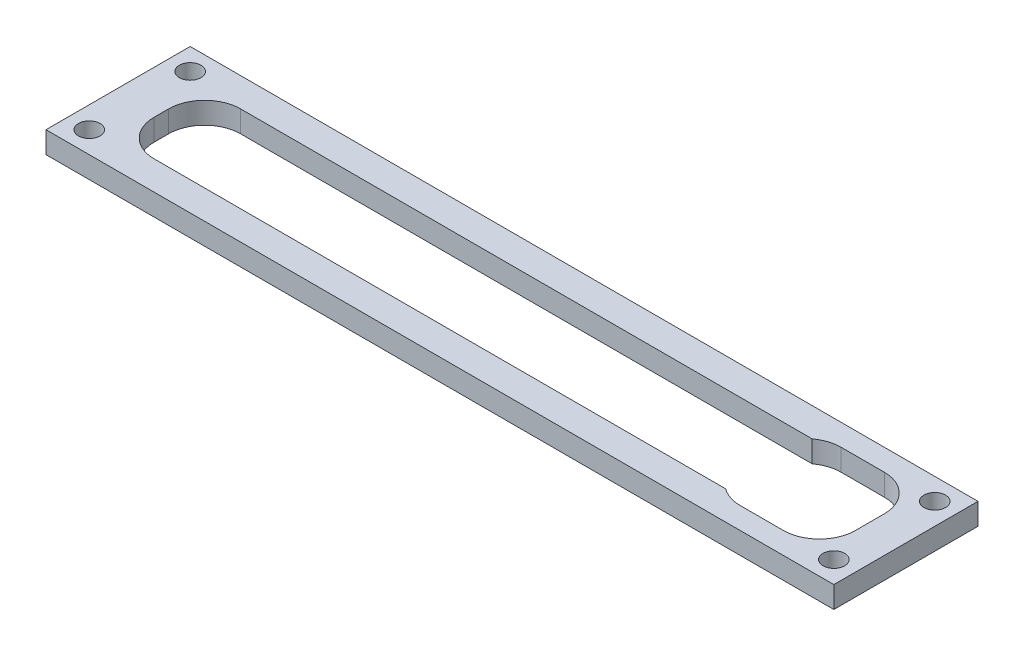
ISO-10303-21;
HEADER;
FILE_DESCRIPTION(('STEP AP214'),'2;1');
FILE_NAME('part.step','',(''),(''),'','','');
FILE_SCHEMA(('AUTOMOTIVE_DESIGN { 1 0 10303 214 1 1 1 1 }'));
ENDSEC;
DATA;
#1=APPLICATION_CONTEXT('core data for automotive mechanical design processes');
#2=APPLICATION_PROTOCOL_DEFINITION('international standard','automotive_design',2000,#1);
#3=PRODUCT_CONTEXT('',#1,'mechanical');
#4=PRODUCT('Part','Part','',(#3));
#5=PRODUCT_RELATED_PRODUCT_CATEGORY('part','',(#4));
#6=PRODUCT_DEFINITION_FORMATION('','',#4);
#7=PRODUCT_DEFINITION_CONTEXT('part definition',#1,'design');
#8=PRODUCT_DEFINITION('design','',#6,#7);
#9=PRODUCT_DEFINITION_SHAPE('','',#8);
#10=(LENGTH_UNIT() NAMED_UNIT(*) SI_UNIT(.MILLI.,.METRE.));
#11=(NAMED_UNIT(*) PLANE_ANGLE_UNIT() SI_UNIT($,.RADIAN.));
#12=(NAMED_UNIT(*) SI_UNIT($,.STERADIAN.) SOLID_ANGLE_UNIT());
#13=UNCERTAINTY_MEASURE_WITH_UNIT(LENGTH_MEASURE(1.E-05),#10,'distance_accuracy_value','');
#14=(GEOMETRIC_REPRESENTATION_CONTEXT(3) GLOBAL_UNCERTAINTY_ASSIGNED_CONTEXT((#13)) GLOBAL_UNIT_ASSIGNED_CONTEXT((#10,
#11,#12)) REPRESENTATION_CONTEXT('',''));
#15=CARTESIAN_POINT('',(0.,0.,0.));
#16=DIRECTION('',(0.,0.,1.));
#17=DIRECTION('',(1.,0.,0.));
#18=AXIS2_PLACEMENT_3D('',#15,#16,#17);
#19=CARTESIAN_POINT('',(0.,3.,0.));
#20=DIRECTION('',(0.,-1.,0.));
#21=DIRECTION('',(0.,0.,-1.));
#22=AXIS2_PLACEMENT_3D('',#19,#20,#21);
#23=PLANE('',#22);
#24=DIRECTION('',(0.,0.,1.));
#25=VECTOR('',#24,1.);
#26=CARTESIAN_POINT('',(0.,3.,0.));
#27=LINE('',#26,#25);
#28=CARTESIAN_POINT('',(0.,3.,-20.));
#29=VERTEX_POINT('',#28);
#30=CARTESIAN_POINT('',(0.,3.,0.));
#31=VERTEX_POINT('',#30);
#32=EDGE_CURVE('E250',#29,#31,#27,.T.);
#33=ORIENTED_EDGE('',*,*,#32,.T.);
#34=DIRECTION('',(1.,0.,0.));
#35=VECTOR('',#34,1.);
#36=CARTESIAN_POINT('',(0.,3.,0.));
#37=LINE('',#36,#35);
#38=CARTESIAN_POINT('',(109.295835398403,3.,0.));
#39=VERTEX_POINT('',#38);
#40=EDGE_CURVE('E253',#31,#39,#37,.T.);
#41=ORIENTED_EDGE('',*,*,#40,.T.);
#42=DIRECTION('',(0.,0.,-1.));
#43=VECTOR('',#42,1.);
#44=CARTESIAN_POINT('',(109.295835398403,3.,0.));
#45=LINE('',#44,#43);
#46=CARTESIAN_POINT('',(109.295835398403,3.,-20.));
#47=VERTEX_POINT('',#46);
#48=EDGE_CURVE('E256',#39,#47,#45,.T.);
#49=ORIENTED_EDGE('',*,*,#48,.T.);
#50=DIRECTION('',(-1.,0.,0.));
#51=VECTOR('',#50,1.);
#52=CARTESIAN_POINT('',(0.,3.,-20.));
#53=LINE('',#52,#51);
#54=EDGE_CURVE('E258',#47,#29,#53,.T.);
#55=ORIENTED_EDGE('',*,*,#54,.T.);
#56=EDGE_LOOP('',(#33,#41,#49,#55));
#57=FACE_BOUND('',#56,.T.);
#58=DIRECTION('',(-1.,0.,0.));
#59=VECTOR('',#58,1.);
#60=CARTESIAN_POINT('',(5.99999999999999,3.,-16.));
#61=LINE('',#60,#59);
#62=CARTESIAN_POINT('',(90.2958353984025,3.,-16.));
#63=VERTEX_POINT('',#62);
#64=CARTESIAN_POINT('',(11.,3.,-16.));
#65=VERTEX_POINT('',#64);
#66=EDGE_CURVE('E243',#63,#65,#61,.T.);
#67=ORIENTED_EDGE('',*,*,#66,.F.);
#68=CARTESIAN_POINT('',(93.2958353984026,3.,-12.));
#69=DIRECTION('',(0.,-1.,0.));
#70=DIRECTION('',(0.,0.,-1.));
#71=AXIS2_PLACEMENT_3D('',#68,#69,#70);
#72=CIRCLE('',#71,5.);
#73=CARTESIAN_POINT('',(93.2958353984026,3.,-17.));
#74=VERTEX_POINT('',#73);
#75=EDGE_CURVE('E193',#63,#74,#72,.T.);
#76=ORIENTED_EDGE('',*,*,#75,.T.);
#77=DIRECTION('',(-1.,0.,0.));
#78=VECTOR('',#77,1.);
#79=CARTESIAN_POINT('',(90.2958353984025,3.,-17.));
#80=LINE('',#79,#78);
#81=CARTESIAN_POINT('',(99.2958353984025,3.,-17.));
#82=VERTEX_POINT('',#81);
#83=EDGE_CURVE('E205',#82,#74,#80,.T.);
#84=ORIENTED_EDGE('',*,*,#83,.F.);
#85=CARTESIAN_POINT('',(99.2958353984025,3.,-12.));
#86=DIRECTION('',(0.,-1.,0.));
#87=DIRECTION('',(0.,0.,-1.));
#88=AXIS2_PLACEMENT_3D('',#85,#86,#87);
#89=CIRCLE('',#88,5.);
#90=CARTESIAN_POINT('',(104.295835398403,3.,-12.));
#91=VERTEX_POINT('',#90);
#92=EDGE_CURVE('E185',#82,#91,#89,.T.);
#93=ORIENTED_EDGE('',*,*,#92,.T.);
#94=DIRECTION('',(0.,0.,-1.));
#95=VECTOR('',#94,1.);
#96=CARTESIAN_POINT('',(104.295835398403,3.,-17.));
#97=LINE('',#96,#95);
#98=CARTESIAN_POINT('',(104.295835398403,3.,-8.00000000000001));
#99=VERTEX_POINT('',#98);
#100=EDGE_CURVE('E202',#99,#91,#97,.T.);
#101=ORIENTED_EDGE('',*,*,#100,.F.);
#102=CARTESIAN_POINT('',(99.2958353984025,3.,-8.00000000000001));
#103=DIRECTION('',(0.,-1.,0.));
#104=DIRECTION('',(0.,0.,-1.));
#105=AXIS2_PLACEMENT_3D('',#102,#103,#104);
#106=CIRCLE('',#105,5.);
#107=CARTESIAN_POINT('',(99.2958353984025,3.,-3.00000000000001));
#108=VERTEX_POINT('',#107);
#109=EDGE_CURVE('E189',#99,#108,#106,.T.);
#110=ORIENTED_EDGE('',*,*,#109,.T.);
#111=DIRECTION('',(1.,0.,0.));
#112=VECTOR('',#111,1.);
#113=CARTESIAN_POINT('',(90.2958353984025,3.,-3.));
#114=LINE('',#113,#112);
#115=CARTESIAN_POINT('',(93.2958353984026,3.,-3.00000000000001));
#116=VERTEX_POINT('',#115);
#117=EDGE_CURVE('E200',#116,#108,#114,.T.);
#118=ORIENTED_EDGE('',*,*,#117,.F.);
#119=CARTESIAN_POINT('',(93.2958353984026,3.,-8.00000000000001));
#120=DIRECTION('',(0.,-1.,0.));
#121=DIRECTION('',(0.,0.,-1.));
#122=AXIS2_PLACEMENT_3D('',#119,#120,#121);
#123=CIRCLE('',#122,5.);
#124=CARTESIAN_POINT('',(90.2958353984025,3.,-4.00000000000002));
#125=VERTEX_POINT('',#124);
#126=EDGE_CURVE('E43',#116,#125,#123,.T.);
#127=ORIENTED_EDGE('',*,*,#126,.T.);
#128=DIRECTION('',(1.,0.,0.));
#129=VECTOR('',#128,1.);
#130=CARTESIAN_POINT('',(5.99999999999999,3.,-4.00000000000002));
#131=LINE('',#130,#129);
#132=CARTESIAN_POINT('',(11.,3.,-4.00000000000002));
#133=VERTEX_POINT('',#132);
#134=EDGE_CURVE('E162',#133,#125,#131,.T.);
#135=ORIENTED_EDGE('',*,*,#134,.F.);
#136=CARTESIAN_POINT('',(11.,3.,-9.00000000000001));
#137=DIRECTION('',(0.,-1.,0.));
#138=DIRECTION('',(0.,0.,-1.));
#139=AXIS2_PLACEMENT_3D('',#136,#137,#138);
#140=CIRCLE('',#139,5.);
#141=CARTESIAN_POINT('',(5.99999999999999,3.,-9.00000000000001));
#142=VERTEX_POINT('',#141);
#143=EDGE_CURVE('E179',#133,#142,#140,.T.);
#144=ORIENTED_EDGE('',*,*,#143,.T.);
#145=DIRECTION('',(0.,0.,1.));
#146=VECTOR('',#145,1.);
#147=CARTESIAN_POINT('',(5.99999999999999,3.,-16.));
#148=LINE('',#147,#146);
#149=CARTESIAN_POINT('',(5.99999999999999,3.,-11.));
#150=VERTEX_POINT('',#149);
#151=EDGE_CURVE('E239',#150,#142,#148,.T.);
#152=ORIENTED_EDGE('',*,*,#151,.F.);
#153=CARTESIAN_POINT('',(11.,3.,-11.));
#154=DIRECTION('',(0.,-1.,0.));
#155=DIRECTION('',(0.,0.,-1.));
#156=AXIS2_PLACEMENT_3D('',#153,#154,#155);
#157=CIRCLE('',#156,5.);
#158=EDGE_CURVE('E183',#150,#65,#157,.T.);
#159=ORIENTED_EDGE('',*,*,#158,.T.);
#160=EDGE_LOOP('',(#67,#76,#84,#93,#101,#110,#118,#127,#135,#144,#152,#159));
#161=FACE_BOUND('',#160,.T.);
#162=CARTESIAN_POINT('',(3.,3.,-17.));
#163=DIRECTION('',(0.,1.,0.));
#164=DIRECTION('',(0.,0.,1.));
#165=AXIS2_PLACEMENT_3D('',#162,#163,#164);
#166=CIRCLE('',#165,1.5);
#167=CARTESIAN_POINT('',(3.,3.,-15.5));
#168=VERTEX_POINT('',#167);
#169=EDGE_CURVE('E234',#168,#168,#166,.T.);
#170=ORIENTED_EDGE('',*,*,#169,.F.);
#171=EDGE_LOOP('',(#170));
#172=FACE_BOUND('',#171,.T.);
#173=CARTESIAN_POINT('',(3.,3.,-3.));
#174=DIRECTION('',(0.,1.,0.));
#175=DIRECTION('',(0.,0.,-1.));
#176=AXIS2_PLACEMENT_3D('',#173,#174,#175);
#177=CIRCLE('',#176,1.5);
#178=CARTESIAN_POINT('',(3.,3.,-4.5));
#179=VERTEX_POINT('',#178);
#180=EDGE_CURVE('E228',#179,#179,#177,.T.);
#181=ORIENTED_EDGE('',*,*,#180,.F.);
#182=EDGE_LOOP('',(#181));
#183=FACE_BOUND('',#182,.T.);
#184=CARTESIAN_POINT('',(106.295835398403,3.,-3.00000000000001));
#185=DIRECTION('',(0.,1.,0.));
#186=DIRECTION('',(0.,0.,1.));
#187=AXIS2_PLACEMENT_3D('',#184,#185,#186);
#188=CIRCLE('',#187,1.5);
#189=CARTESIAN_POINT('',(106.295835398403,3.,-1.50000000000001));
#190=VERTEX_POINT('',#189);
#191=EDGE_CURVE('E222',#190,#190,#188,.T.);
#192=ORIENTED_EDGE('',*,*,#191,.F.);
#193=EDGE_LOOP('',(#192));
#194=FACE_BOUND('',#193,.T.);
#195=CARTESIAN_POINT('',(106.295835398403,3.,-17.));
#196=DIRECTION('',(0.,1.,0.));
#197=DIRECTION('',(0.,0.,-1.));
#198=AXIS2_PLACEMENT_3D('',#195,#196,#197);
#199=CIRCLE('',#198,1.5);
#200=CARTESIAN_POINT('',(106.295835398403,3.,-18.5));
#201=VERTEX_POINT('',#200);
#202=EDGE_CURVE('E216',#201,#201,#199,.T.);
#203=ORIENTED_EDGE('',*,*,#202,.F.);
#204=EDGE_LOOP('',(#203));
#205=FACE_BOUND('',#204,.T.);
#206=ADVANCED_FACE('F35',(#57,#161,#172,#183,#194,#205),#23,.F.);
#207=CARTESIAN_POINT('',(0.,0.,0.));
#208=DIRECTION('',(0.,-1.,0.));
#209=DIRECTION('',(0.,0.,-1.));
#210=AXIS2_PLACEMENT_3D('',#207,#208,#209);
#211=PLANE('',#210);
#212=DIRECTION('',(-1.,0.,0.));
#213=VECTOR('',#212,1.);
#214=CARTESIAN_POINT('',(90.2958353984025,0.,-17.));
#215=LINE('',#214,#213);
#216=CARTESIAN_POINT('',(99.2958353984025,0.,-17.));
#217=VERTEX_POINT('',#216);
#218=CARTESIAN_POINT('',(93.2958353984026,0.,-17.));
#219=VERTEX_POINT('',#218);
#220=EDGE_CURVE('E165',#217,#219,#215,.T.);
#221=ORIENTED_EDGE('',*,*,#220,.T.);
#222=CARTESIAN_POINT('',(93.2958353984026,0.,-12.));
#223=DIRECTION('',(0.,-1.,0.));
#224=DIRECTION('',(0.,0.,-1.));
#225=AXIS2_PLACEMENT_3D('',#222,#223,#224);
#226=CIRCLE('',#225,5.);
#227=CARTESIAN_POINT('',(90.2958353984025,0.,-16.));
#228=VERTEX_POINT('',#227);
#229=EDGE_CURVE('E195',#219,#228,#226,.F.);
#230=ORIENTED_EDGE('',*,*,#229,.T.);
#231=DIRECTION('',(-1.,0.,0.));
#232=VECTOR('',#231,1.);
#233=CARTESIAN_POINT('',(5.99999999999999,0.,-16.));
#234=LINE('',#233,#232);
#235=CARTESIAN_POINT('',(11.,0.,-16.));
#236=VERTEX_POINT('',#235);
#237=EDGE_CURVE('E154',#228,#236,#234,.T.);
#238=ORIENTED_EDGE('',*,*,#237,.T.);
#239=CARTESIAN_POINT('',(11.,0.,-11.));
#240=DIRECTION('',(0.,-1.,0.));
#241=DIRECTION('',(0.,0.,-1.));
#242=AXIS2_PLACEMENT_3D('',#239,#240,#241);
#243=CIRCLE('',#242,5.);
#244=CARTESIAN_POINT('',(5.99999999999999,0.,-11.));
#245=VERTEX_POINT('',#244);
#246=EDGE_CURVE('E181',#236,#245,#243,.F.);
#247=ORIENTED_EDGE('',*,*,#246,.T.);
#248=DIRECTION('',(0.,0.,1.));
#249=VECTOR('',#248,1.);
#250=CARTESIAN_POINT('',(5.99999999999999,0.,-16.));
#251=LINE('',#250,#249);
#252=CARTESIAN_POINT('',(5.99999999999999,0.,-9.00000000000001));
#253=VERTEX_POINT('',#252);
#254=EDGE_CURVE('E155',#245,#253,#251,.T.);
#255=ORIENTED_EDGE('',*,*,#254,.T.);
#256=CARTESIAN_POINT('',(11.,0.,-9.00000000000001));
#257=DIRECTION('',(0.,-1.,0.));
#258=DIRECTION('',(0.,0.,-1.));
#259=AXIS2_PLACEMENT_3D('',#256,#257,#258);
#260=CIRCLE('',#259,5.);
#261=CARTESIAN_POINT('',(11.,0.,-4.00000000000002));
#262=VERTEX_POINT('',#261);
#263=EDGE_CURVE('E151',#253,#262,#260,.F.);
#264=ORIENTED_EDGE('',*,*,#263,.T.);
#265=DIRECTION('',(1.,0.,0.));
#266=VECTOR('',#265,1.);
#267=CARTESIAN_POINT('',(5.99999999999999,0.,-4.00000000000002));
#268=LINE('',#267,#266);
#269=CARTESIAN_POINT('',(90.2958353984025,0.,-4.00000000000002));
#270=VERTEX_POINT('',#269);
#271=EDGE_CURVE('E145',#262,#270,#268,.T.);
#272=ORIENTED_EDGE('',*,*,#271,.T.);
#273=CARTESIAN_POINT('',(93.2958353984026,0.,-8.00000000000001));
#274=DIRECTION('',(0.,-1.,0.));
#275=DIRECTION('',(0.,0.,-1.));
#276=AXIS2_PLACEMENT_3D('',#273,#274,#275);
#277=CIRCLE('',#276,5.);
#278=CARTESIAN_POINT('',(93.2958353984026,0.,-3.00000000000001));
#279=VERTEX_POINT('',#278);
#280=EDGE_CURVE('E11',#270,#279,#277,.F.);
#281=ORIENTED_EDGE('',*,*,#280,.T.);
#282=DIRECTION('',(1.,0.,0.));
#283=VECTOR('',#282,1.);
#284=CARTESIAN_POINT('',(90.2958353984025,0.,-3.));
#285=LINE('',#284,#283);
#286=CARTESIAN_POINT('',(99.2958353984025,0.,-3.00000000000001));
#287=VERTEX_POINT('',#286);
#288=EDGE_CURVE('E212',#279,#287,#285,.T.);
#289=ORIENTED_EDGE('',*,*,#288,.T.);
#290=CARTESIAN_POINT('',(99.2958353984025,0.,-8.00000000000001));
#291=DIRECTION('',(0.,-1.,0.));
#292=DIRECTION('',(0.,0.,-1.));
#293=AXIS2_PLACEMENT_3D('',#290,#291,#292);
#294=CIRCLE('',#293,5.);
#295=CARTESIAN_POINT('',(104.295835398403,0.,-8.00000000000001));
#296=VERTEX_POINT('',#295);
#297=EDGE_CURVE('E191',#287,#296,#294,.F.);
#298=ORIENTED_EDGE('',*,*,#297,.T.);
#299=DIRECTION('',(0.,0.,-1.));
#300=VECTOR('',#299,1.);
#301=CARTESIAN_POINT('',(104.295835398403,0.,-17.));
#302=LINE('',#301,#300);
#303=CARTESIAN_POINT('',(104.295835398403,0.,-12.));
#304=VERTEX_POINT('',#303);
#305=EDGE_CURVE('E300',#296,#304,#302,.T.);
#306=ORIENTED_EDGE('',*,*,#305,.T.);
#307=CARTESIAN_POINT('',(99.2958353984025,0.,-12.));
#308=DIRECTION('',(0.,-1.,0.));
#309=DIRECTION('',(0.,0.,-1.));
#310=AXIS2_PLACEMENT_3D('',#307,#308,#309);
#311=CIRCLE('',#310,5.);
#312=EDGE_CURVE('E187',#304,#217,#311,.F.);
#313=ORIENTED_EDGE('',*,*,#312,.T.);
#314=EDGE_LOOP('',(#221,#230,#238,#247,#255,#264,#272,#281,#289,#298,#306,#313));
#315=FACE_BOUND('',#314,.T.);
#316=CARTESIAN_POINT('',(106.295835398403,0.,-3.00000000000001));
#317=DIRECTION('',(0.,1.,0.));
#318=DIRECTION('',(0.,0.,1.));
#319=AXIS2_PLACEMENT_3D('',#316,#317,#318);
#320=CIRCLE('',#319,1.5);
#321=CARTESIAN_POINT('',(106.295835398403,0.,-1.50000000000001));
#322=VERTEX_POINT('',#321);
#323=EDGE_CURVE('E219',#322,#322,#320,.T.);
#324=ORIENTED_EDGE('',*,*,#323,.T.);
#325=EDGE_LOOP('',(#324));
#326=FACE_BOUND('',#325,.T.);
#327=CARTESIAN_POINT('',(3.,0.,-17.));
#328=DIRECTION('',(0.,1.,0.));
#329=DIRECTION('',(0.,0.,1.));
#330=AXIS2_PLACEMENT_3D('',#327,#328,#329);
#331=CIRCLE('',#330,1.5);
#332=CARTESIAN_POINT('',(3.,0.,-15.5));
#333=VERTEX_POINT('',#332);
#334=EDGE_CURVE('E231',#333,#333,#331,.T.);
#335=ORIENTED_EDGE('',*,*,#334,.T.);
#336=EDGE_LOOP('',(#335));
#337=FACE_BOUND('',#336,.T.);
#338=DIRECTION('',(0.,0.,1.));
#339=VECTOR('',#338,1.);
#340=CARTESIAN_POINT('',(0.,0.,0.));
#341=LINE('',#340,#339);
#342=CARTESIAN_POINT('',(0.,0.,-20.));
#343=VERTEX_POINT('',#342);
#344=CARTESIAN_POINT('',(0.,0.,0.));
#345=VERTEX_POINT('',#344);
#346=EDGE_CURVE('E246',#343,#345,#341,.T.);
#347=ORIENTED_EDGE('',*,*,#346,.F.);
#348=DIRECTION('',(-1.,0.,0.));
#349=VECTOR('',#348,1.);
#350=CARTESIAN_POINT('',(0.,0.,-20.));
#351=LINE('',#350,#349);
#352=CARTESIAN_POINT('',(109.295835398403,0.,-20.));
#353=VERTEX_POINT('',#352);
#354=EDGE_CURVE('E254',#353,#343,#351,.T.);
#355=ORIENTED_EDGE('',*,*,#354,.F.);
#356=DIRECTION('',(0.,0.,-1.));
#357=VECTOR('',#356,1.);
#358=CARTESIAN_POINT('',(109.295835398403,0.,0.));
#359=LINE('',#358,#357);
#360=CARTESIAN_POINT('',(109.295835398403,0.,0.));
#361=VERTEX_POINT('',#360);
#362=EDGE_CURVE('E265',#361,#353,#359,.T.);
#363=ORIENTED_EDGE('',*,*,#362,.F.);
#364=DIRECTION('',(1.,0.,0.));
#365=VECTOR('',#364,1.);
#366=CARTESIAN_POINT('',(0.,0.,0.));
#367=LINE('',#366,#365);
#368=EDGE_CURVE('E263',#345,#361,#367,.T.);
#369=ORIENTED_EDGE('',*,*,#368,.F.);
#370=EDGE_LOOP('',(#347,#355,#363,#369));
#371=FACE_BOUND('',#370,.T.);
#372=CARTESIAN_POINT('',(3.,0.,-3.));
#373=DIRECTION('',(0.,1.,0.));
#374=DIRECTION('',(0.,0.,-1.));
#375=AXIS2_PLACEMENT_3D('',#372,#373,#374);
#376=CIRCLE('',#375,1.5);
#377=CARTESIAN_POINT('',(3.,0.,-4.5));
#378=VERTEX_POINT('',#377);
#379=EDGE_CURVE('E225',#378,#378,#376,.T.);
#380=ORIENTED_EDGE('',*,*,#379,.T.);
#381=EDGE_LOOP('',(#380));
#382=FACE_BOUND('',#381,.T.);
#383=CARTESIAN_POINT('',(106.295835398403,0.,-17.));
#384=DIRECTION('',(0.,1.,0.));
#385=DIRECTION('',(0.,0.,-1.));
#386=AXIS2_PLACEMENT_3D('',#383,#384,#385);
#387=CIRCLE('',#386,1.5);
#388=CARTESIAN_POINT('',(106.295835398403,0.,-18.5));
#389=VERTEX_POINT('',#388);
#390=EDGE_CURVE('E214',#389,#389,#387,.T.);
#391=ORIENTED_EDGE('',*,*,#390,.T.);
#392=EDGE_LOOP('',(#391));
#393=FACE_BOUND('',#392,.T.);
#394=ADVANCED_FACE('F148',(#315,#326,#337,#371,#382,#393),#211,.T.);
#395=CARTESIAN_POINT('',(0.,3.,0.));
#396=DIRECTION('',(1.,0.,0.));
#397=DIRECTION('',(0.,0.,-1.));
#398=AXIS2_PLACEMENT_3D('',#395,#396,#397);
#399=PLANE('',#398);
#400=ORIENTED_EDGE('',*,*,#346,.T.);
#401=DIRECTION('',(0.,-1.,0.));
#402=VECTOR('',#401,1.);
#403=CARTESIAN_POINT('',(0.,3.,0.));
#404=LINE('',#403,#402);
#405=EDGE_CURVE('E276',#31,#345,#404,.T.);
#406=ORIENTED_EDGE('',*,*,#405,.F.);
#407=ORIENTED_EDGE('',*,*,#32,.F.);
#408=DIRECTION('',(0.,-1.,0.));
#409=VECTOR('',#408,1.);
#410=CARTESIAN_POINT('',(0.,3.,-20.));
#411=LINE('',#410,#409);
#412=EDGE_CURVE('E260',#29,#343,#411,.T.);
#413=ORIENTED_EDGE('',*,*,#412,.T.);
#414=EDGE_LOOP('',(#400,#406,#407,#413));
#415=FACE_BOUND('',#414,.T.);
#416=ADVANCED_FACE('F331',(#415),#399,.F.);
#417=CARTESIAN_POINT('',(0.,3.,0.));
#418=DIRECTION('',(0.,0.,-1.));
#419=DIRECTION('',(-1.,0.,0.));
#420=AXIS2_PLACEMENT_3D('',#417,#418,#419);
#421=PLANE('',#420);
#422=ORIENTED_EDGE('',*,*,#368,.T.);
#423=DIRECTION('',(0.,-1.,0.));
#424=VECTOR('',#423,1.);
#425=CARTESIAN_POINT('',(109.295835398403,3.,0.));
#426=LINE('',#425,#424);
#427=EDGE_CURVE('E273',#39,#361,#426,.T.);
#428=ORIENTED_EDGE('',*,*,#427,.F.);
#429=ORIENTED_EDGE('',*,*,#40,.F.);
#430=ORIENTED_EDGE('',*,*,#405,.T.);
#431=EDGE_LOOP('',(#422,#428,#429,#430));
#432=FACE_BOUND('',#431,.T.);
#433=ADVANCED_FACE('F344',(#432),#421,.F.);
#434=CARTESIAN_POINT('',(109.295835398403,3.,0.));
#435=DIRECTION('',(-1.,0.,0.));
#436=DIRECTION('',(0.,0.,1.));
#437=AXIS2_PLACEMENT_3D('',#434,#435,#436);
#438=PLANE('',#437);
#439=ORIENTED_EDGE('',*,*,#362,.T.);
#440=DIRECTION('',(0.,-1.,0.));
#441=VECTOR('',#440,1.);
#442=CARTESIAN_POINT('',(109.295835398403,3.,-20.));
#443=LINE('',#442,#441);
#444=EDGE_CURVE('E270',#47,#353,#443,.T.);
#445=ORIENTED_EDGE('',*,*,#444,.F.);
#446=ORIENTED_EDGE('',*,*,#48,.F.);
#447=ORIENTED_EDGE('',*,*,#427,.T.);
#448=EDGE_LOOP('',(#439,#445,#446,#447));
#449=FACE_BOUND('',#448,.T.);
#450=ADVANCED_FACE('F340',(#449),#438,.F.);
#451=CARTESIAN_POINT('',(0.,3.,-20.));
#452=DIRECTION('',(0.,0.,1.));
#453=DIRECTION('',(1.,0.,0.));
#454=AXIS2_PLACEMENT_3D('',#451,#452,#453);
#455=PLANE('',#454);
#456=ORIENTED_EDGE('',*,*,#354,.T.);
#457=ORIENTED_EDGE('',*,*,#412,.F.);
#458=ORIENTED_EDGE('',*,*,#54,.F.);
#459=ORIENTED_EDGE('',*,*,#444,.T.);
#460=EDGE_LOOP('',(#456,#457,#458,#459));
#461=FACE_BOUND('',#460,.T.);
#462=ADVANCED_FACE('F337',(#461),#455,.F.);
#463=CARTESIAN_POINT('',(5.99999999999999,3.,-16.));
#464=DIRECTION('',(1.,0.,0.));
#465=DIRECTION('',(0.,0.,-1.));
#466=AXIS2_PLACEMENT_3D('',#463,#464,#465);
#467=PLANE('',#466);
#468=ORIENTED_EDGE('',*,*,#151,.T.);
#469=DIRECTION('',(0.,-1.,0.));
#470=VECTOR('',#469,1.);
#471=CARTESIAN_POINT('',(5.99999999999999,0.,-9.00000000000001));
#472=LINE('',#471,#470);
#473=EDGE_CURVE('E281',#142,#253,#472,.T.);
#474=ORIENTED_EDGE('',*,*,#473,.T.);
#475=ORIENTED_EDGE('',*,*,#254,.F.);
#476=DIRECTION('',(0.,-1.,0.));
#477=VECTOR('',#476,1.);
#478=CARTESIAN_POINT('',(5.99999999999999,3.,-11.));
#479=LINE('',#478,#477);
#480=EDGE_CURVE('E279',#245,#150,#479,.F.);
#481=ORIENTED_EDGE('',*,*,#480,.T.);
#482=EDGE_LOOP('',(#468,#474,#475,#481));
#483=FACE_BOUND('',#482,.T.);
#484=ADVANCED_FACE('F334',(#483),#467,.T.);
#485=CARTESIAN_POINT('',(5.99999999999999,3.,-4.00000000000002));
#486=DIRECTION('',(0.,0.,-1.));
#487=DIRECTION('',(-1.,0.,0.));
#488=AXIS2_PLACEMENT_3D('',#485,#486,#487);
#489=PLANE('',#488);
#490=ORIENTED_EDGE('',*,*,#271,.F.);
#491=DIRECTION('',(0.,-1.,0.));
#492=VECTOR('',#491,1.);
#493=CARTESIAN_POINT('',(11.,3.,-4.00000000000002));
#494=LINE('',#493,#492);
#495=EDGE_CURVE('E284',#262,#133,#494,.F.);
#496=ORIENTED_EDGE('',*,*,#495,.T.);
#497=ORIENTED_EDGE('',*,*,#134,.T.);
#498=DIRECTION('',(0.,1.,0.));
#499=VECTOR('',#498,1.);
#500=CARTESIAN_POINT('',(90.2958353984025,0.,-4.00000000000002));
#501=LINE('',#500,#499);
#502=EDGE_CURVE('E159',#270,#125,#501,.T.);
#503=ORIENTED_EDGE('',*,*,#502,.F.);
#504=EDGE_LOOP('',(#490,#496,#497,#503));
#505=FACE_BOUND('',#504,.T.);
#506=ADVANCED_FACE('F160',(#505),#489,.T.);
#507=CARTESIAN_POINT('',(5.99999999999999,3.,-16.));
#508=DIRECTION('',(0.,0.,1.));
#509=DIRECTION('',(1.,0.,0.));
#510=AXIS2_PLACEMENT_3D('',#507,#508,#509);
#511=PLANE('',#510);
#512=ORIENTED_EDGE('',*,*,#66,.T.);
#513=DIRECTION('',(0.,-1.,0.));
#514=VECTOR('',#513,1.);
#515=CARTESIAN_POINT('',(11.,0.,-16.));
#516=LINE('',#515,#514);
#517=EDGE_CURVE('E286',#65,#236,#516,.T.);
#518=ORIENTED_EDGE('',*,*,#517,.T.);
#519=ORIENTED_EDGE('',*,*,#237,.F.);
#520=DIRECTION('',(0.,1.,0.));
#521=VECTOR('',#520,1.);
#522=CARTESIAN_POINT('',(90.2958353984025,0.,-16.));
#523=LINE('',#522,#521);
#524=EDGE_CURVE('E164',#228,#63,#523,.T.);
#525=ORIENTED_EDGE('',*,*,#524,.T.);
#526=EDGE_LOOP('',(#512,#518,#519,#525));
#527=FACE_BOUND('',#526,.T.);
#528=ADVANCED_FACE('F366',(#527),#511,.T.);
#529=CARTESIAN_POINT('',(3.,3.,-17.));
#530=DIRECTION('',(0.,-1.,0.));
#531=DIRECTION('',(0.,0.,-1.));
#532=AXIS2_PLACEMENT_3D('',#529,#530,#531);
#533=CYLINDRICAL_SURFACE('',#532,1.5);
#534=ORIENTED_EDGE('',*,*,#169,.T.);
#535=EDGE_LOOP('',(#534));
#536=FACE_BOUND('',#535,.T.);
#537=ORIENTED_EDGE('',*,*,#334,.F.);
#538=EDGE_LOOP('',(#537));
#539=FACE_BOUND('',#538,.T.);
#540=ADVANCED_FACE('F379',(#536,#539),#533,.F.);
#541=CARTESIAN_POINT('',(3.,3.,-3.));
#542=DIRECTION('',(0.,-1.,0.));
#543=DIRECTION('',(0.,0.,-1.));
#544=AXIS2_PLACEMENT_3D('',#541,#542,#543);
#545=CYLINDRICAL_SURFACE('',#544,1.5);
#546=ORIENTED_EDGE('',*,*,#180,.T.);
#547=EDGE_LOOP('',(#546));
#548=FACE_BOUND('',#547,.T.);
#549=ORIENTED_EDGE('',*,*,#379,.F.);
#550=EDGE_LOOP('',(#549));
#551=FACE_BOUND('',#550,.T.);
#552=ADVANCED_FACE('F384',(#548,#551),#545,.F.);
#553=CARTESIAN_POINT('',(106.295835398403,3.,-3.00000000000001));
#554=DIRECTION('',(0.,-1.,0.));
#555=DIRECTION('',(0.,0.,-1.));
#556=AXIS2_PLACEMENT_3D('',#553,#554,#555);
#557=CYLINDRICAL_SURFACE('',#556,1.5);
#558=ORIENTED_EDGE('',*,*,#191,.T.);
#559=EDGE_LOOP('',(#558));
#560=FACE_BOUND('',#559,.T.);
#561=ORIENTED_EDGE('',*,*,#323,.F.);
#562=EDGE_LOOP('',(#561));
#563=FACE_BOUND('',#562,.T.);
#564=ADVANCED_FACE('F388',(#560,#563),#557,.F.);
#565=CARTESIAN_POINT('',(106.295835398403,3.,-17.));
#566=DIRECTION('',(0.,-1.,0.));
#567=DIRECTION('',(0.,0.,-1.));
#568=AXIS2_PLACEMENT_3D('',#565,#566,#567);
#569=CYLINDRICAL_SURFACE('',#568,1.5);
#570=ORIENTED_EDGE('',*,*,#202,.T.);
#571=EDGE_LOOP('',(#570));
#572=FACE_BOUND('',#571,.T.);
#573=ORIENTED_EDGE('',*,*,#390,.F.);
#574=EDGE_LOOP('',(#573));
#575=FACE_BOUND('',#574,.T.);
#576=ADVANCED_FACE('F392',(#572,#575),#569,.F.);
#577=CARTESIAN_POINT('',(90.2958353984025,0.,-17.));
#578=DIRECTION('',(0.,0.,-1.));
#579=DIRECTION('',(-1.,0.,0.));
#580=AXIS2_PLACEMENT_3D('',#577,#578,#579);
#581=PLANE('',#580);
#582=ORIENTED_EDGE('',*,*,#220,.F.);
#583=DIRECTION('',(0.,1.,0.));
#584=VECTOR('',#583,1.);
#585=CARTESIAN_POINT('',(99.2958353984025,3.,-17.));
#586=LINE('',#585,#584);
#587=EDGE_CURVE('E291',#217,#82,#586,.T.);
#588=ORIENTED_EDGE('',*,*,#587,.T.);
#589=ORIENTED_EDGE('',*,*,#83,.T.);
#590=DIRECTION('',(0.,1.,0.));
#591=VECTOR('',#590,1.);
#592=CARTESIAN_POINT('',(93.2958353984026,0.,-17.));
#593=LINE('',#592,#591);
#594=EDGE_CURVE('E289',#74,#219,#593,.F.);
#595=ORIENTED_EDGE('',*,*,#594,.T.);
#596=EDGE_LOOP('',(#582,#588,#589,#595));
#597=FACE_BOUND('',#596,.T.);
#598=ADVANCED_FACE('F310',(#597),#581,.F.);
#599=CARTESIAN_POINT('',(104.295835398403,0.,-17.));
#600=DIRECTION('',(1.,0.,0.));
#601=DIRECTION('',(0.,0.,-1.));
#602=AXIS2_PLACEMENT_3D('',#599,#600,#601);
#603=PLANE('',#602);
#604=ORIENTED_EDGE('',*,*,#100,.T.);
#605=DIRECTION('',(0.,1.,0.));
#606=VECTOR('',#605,1.);
#607=CARTESIAN_POINT('',(104.295835398403,0.,-12.));
#608=LINE('',#607,#606);
#609=EDGE_CURVE('E171',#91,#304,#608,.F.);
#610=ORIENTED_EDGE('',*,*,#609,.T.);
#611=ORIENTED_EDGE('',*,*,#305,.F.);
#612=DIRECTION('',(0.,1.,0.));
#613=VECTOR('',#612,1.);
#614=CARTESIAN_POINT('',(104.295835398403,3.,-8.00000000000001));
#615=LINE('',#614,#613);
#616=EDGE_CURVE('E174',#296,#99,#615,.T.);
#617=ORIENTED_EDGE('',*,*,#616,.T.);
#618=EDGE_LOOP('',(#604,#610,#611,#617));
#619=FACE_BOUND('',#618,.T.);
#620=ADVANCED_FACE('F297',(#619),#603,.F.);
#621=CARTESIAN_POINT('',(90.2958353984025,0.,-3.));
#622=DIRECTION('',(0.,0.,1.));
#623=DIRECTION('',(1.,0.,0.));
#624=AXIS2_PLACEMENT_3D('',#621,#622,#623);
#625=PLANE('',#624);
#626=ORIENTED_EDGE('',*,*,#117,.T.);
#627=DIRECTION('',(0.,1.,0.));
#628=VECTOR('',#627,1.);
#629=CARTESIAN_POINT('',(99.2958353984025,0.,-3.00000000000001));
#630=LINE('',#629,#628);
#631=EDGE_CURVE('E50',#108,#287,#630,.F.);
#632=ORIENTED_EDGE('',*,*,#631,.T.);
#633=ORIENTED_EDGE('',*,*,#288,.F.);
#634=DIRECTION('',(0.,-1.,0.));
#635=VECTOR('',#634,1.);
#636=CARTESIAN_POINT('',(93.2958353984026,0.,-3.00000000000001));
#637=LINE('',#636,#635);
#638=EDGE_CURVE('E169',#279,#116,#637,.F.);
#639=ORIENTED_EDGE('',*,*,#638,.T.);
#640=EDGE_LOOP('',(#626,#632,#633,#639));
#641=FACE_BOUND('',#640,.T.);
#642=ADVANCED_FACE('F355',(#641),#625,.F.);
#643=CARTESIAN_POINT('',(11.,3.,-9.00000000000001));
#644=DIRECTION('',(0.,1.,0.));
#645=DIRECTION('',(0.,0.,1.));
#646=AXIS2_PLACEMENT_3D('',#643,#644,#645);
#647=CYLINDRICAL_SURFACE('',#646,5.);
#648=ORIENTED_EDGE('',*,*,#143,.F.);
#649=ORIENTED_EDGE('',*,*,#495,.F.);
#650=ORIENTED_EDGE('',*,*,#263,.F.);
#651=ORIENTED_EDGE('',*,*,#473,.F.);
#652=EDGE_LOOP('',(#648,#649,#650,#651));
#653=FACE_BOUND('',#652,.T.);
#654=ADVANCED_FACE('F352',(#653),#647,.F.);
#655=CARTESIAN_POINT('',(11.,3.,-11.));
#656=DIRECTION('',(0.,1.,0.));
#657=DIRECTION('',(0.,0.,1.));
#658=AXIS2_PLACEMENT_3D('',#655,#656,#657);
#659=CYLINDRICAL_SURFACE('',#658,5.);
#660=ORIENTED_EDGE('',*,*,#158,.F.);
#661=ORIENTED_EDGE('',*,*,#480,.F.);
#662=ORIENTED_EDGE('',*,*,#246,.F.);
#663=ORIENTED_EDGE('',*,*,#517,.F.);
#664=EDGE_LOOP('',(#660,#661,#662,#663));
#665=FACE_BOUND('',#664,.T.);
#666=ADVANCED_FACE('F323',(#665),#659,.F.);
#667=CARTESIAN_POINT('',(99.2958353984025,0.,-12.));
#668=DIRECTION('',(0.,-1.,0.));
#669=DIRECTION('',(0.,0.,-1.));
#670=AXIS2_PLACEMENT_3D('',#667,#668,#669);
#671=CYLINDRICAL_SURFACE('',#670,5.);
#672=ORIENTED_EDGE('',*,*,#312,.F.);
#673=ORIENTED_EDGE('',*,*,#609,.F.);
#674=ORIENTED_EDGE('',*,*,#92,.F.);
#675=ORIENTED_EDGE('',*,*,#587,.F.);
#676=EDGE_LOOP('',(#672,#673,#674,#675));
#677=FACE_BOUND('',#676,.T.);
#678=ADVANCED_FACE('F307',(#677),#671,.F.);
#679=CARTESIAN_POINT('',(99.2958353984025,0.,-8.00000000000001));
#680=DIRECTION('',(0.,-1.,0.));
#681=DIRECTION('',(0.,0.,-1.));
#682=AXIS2_PLACEMENT_3D('',#679,#680,#681);
#683=CYLINDRICAL_SURFACE('',#682,5.);
#684=ORIENTED_EDGE('',*,*,#297,.F.);
#685=ORIENTED_EDGE('',*,*,#631,.F.);
#686=ORIENTED_EDGE('',*,*,#109,.F.);
#687=ORIENTED_EDGE('',*,*,#616,.F.);
#688=EDGE_LOOP('',(#684,#685,#686,#687));
#689=FACE_BOUND('',#688,.T.);
#690=ADVANCED_FACE('F314',(#689),#683,.F.);
#691=CARTESIAN_POINT('',(93.2958353984026,0.,-12.));
#692=DIRECTION('',(0.,1.,0.));
#693=DIRECTION('',(0.,0.,1.));
#694=AXIS2_PLACEMENT_3D('',#691,#692,#693);
#695=CYLINDRICAL_SURFACE('',#694,5.);
#696=ORIENTED_EDGE('',*,*,#229,.F.);
#697=ORIENTED_EDGE('',*,*,#594,.F.);
#698=ORIENTED_EDGE('',*,*,#75,.F.);
#699=ORIENTED_EDGE('',*,*,#524,.F.);
#700=EDGE_LOOP('',(#696,#697,#698,#699));
#701=FACE_BOUND('',#700,.T.);
#702=ADVANCED_FACE('F316',(#701),#695,.F.);
#703=CARTESIAN_POINT('',(93.2958353984026,0.,-8.00000000000001));
#704=DIRECTION('',(0.,-1.,0.));
#705=DIRECTION('',(0.,0.,-1.));
#706=AXIS2_PLACEMENT_3D('',#703,#704,#705);
#707=CYLINDRICAL_SURFACE('',#706,5.);
#708=ORIENTED_EDGE('',*,*,#280,.F.);
#709=ORIENTED_EDGE('',*,*,#502,.T.);
#710=ORIENTED_EDGE('',*,*,#126,.F.);
#711=ORIENTED_EDGE('',*,*,#638,.F.);
#712=EDGE_LOOP('',(#708,#709,#710,#711));
#713=FACE_BOUND('',#712,.T.);
#714=ADVANCED_FACE('F37',(#713),#707,.F.);
#715=CLOSED_SHELL('',(#206,#394,#416,#433,#450,#462,#484,#506,#528,#540,#552,#564,#576,#598,
#620,#642,#654,#666,#678,#690,#702,#714));
#716=MANIFOLD_SOLID_BREP('B2',#715);
#717=ADVANCED_BREP_SHAPE_REPRESENTATION('',(#18,#716),#14);
#718=SHAPE_DEFINITION_REPRESENTATION(#9,#717);
ENDSEC;
END-ISO-10303-21;
